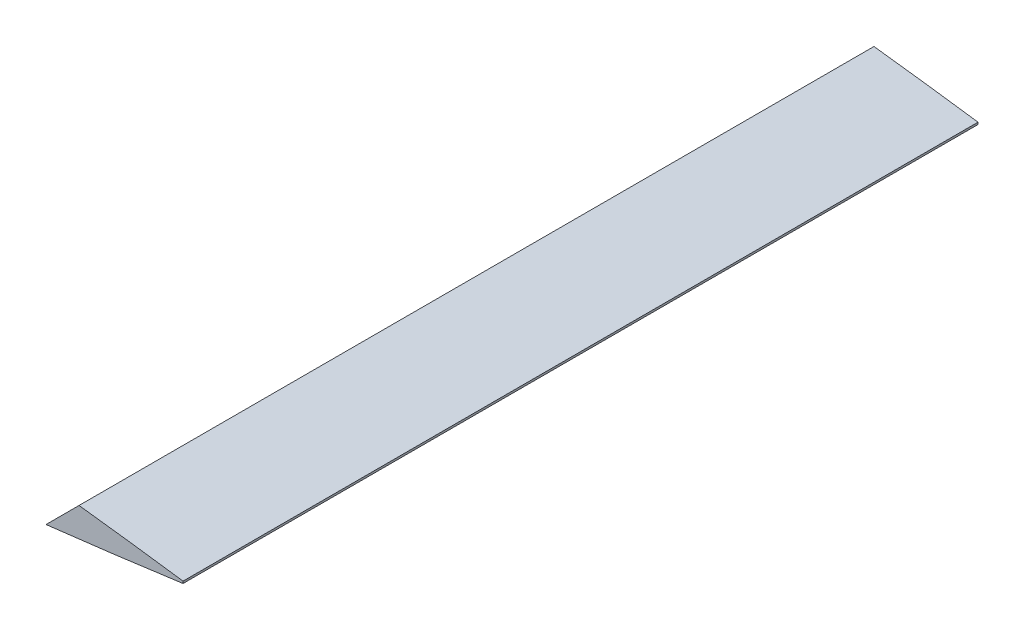
ISO-10303-21;
HEADER;
FILE_DESCRIPTION(('STEP AP214'),'2;1');
FILE_NAME('part.step','',(''),(''),'','','');
FILE_SCHEMA(('AUTOMOTIVE_DESIGN { 1 0 10303 214 1 1 1 1 }'));
ENDSEC;
DATA;
#1=APPLICATION_CONTEXT('core data for automotive mechanical design processes');
#2=APPLICATION_PROTOCOL_DEFINITION('international standard','automotive_design',2000,#1);
#3=PRODUCT_CONTEXT('',#1,'mechanical');
#4=PRODUCT('Part','Part','',(#3));
#5=PRODUCT_RELATED_PRODUCT_CATEGORY('part','',(#4));
#6=PRODUCT_DEFINITION_FORMATION('','',#4);
#7=PRODUCT_DEFINITION_CONTEXT('part definition',#1,'design');
#8=PRODUCT_DEFINITION('design','',#6,#7);
#9=PRODUCT_DEFINITION_SHAPE('','',#8);
#10=(LENGTH_UNIT() NAMED_UNIT(*) SI_UNIT(.MILLI.,.METRE.));
#11=(NAMED_UNIT(*) PLANE_ANGLE_UNIT() SI_UNIT($,.RADIAN.));
#12=(NAMED_UNIT(*) SI_UNIT($,.STERADIAN.) SOLID_ANGLE_UNIT());
#13=UNCERTAINTY_MEASURE_WITH_UNIT(LENGTH_MEASURE(1.E-05),#10,'distance_accuracy_value','');
#14=(GEOMETRIC_REPRESENTATION_CONTEXT(3) GLOBAL_UNCERTAINTY_ASSIGNED_CONTEXT((#13)) GLOBAL_UNIT_ASSIGNED_CONTEXT((#10,
#11,#12)) REPRESENTATION_CONTEXT('',''));
#15=CARTESIAN_POINT('',(0.,0.,0.));
#16=DIRECTION('',(0.,0.,1.));
#17=DIRECTION('',(1.,0.,0.));
#18=AXIS2_PLACEMENT_3D('',#15,#16,#17);
#19=CARTESIAN_POINT('',(300.,0.378,290.));
#20=CARTESIAN_POINT('',(299.270406423723,0.479445821702321,290.));
#21=CARTESIAN_POINT('',(297.234667094079,0.762503753929655,290.));
#22=CARTESIAN_POINT('',(293.659650160598,1.25767350567564,290.));
#23=CARTESIAN_POINT('',(289.112411794917,1.87424244263317,290.));
#24=CARTESIAN_POINT('',(284.080816659039,2.54451744035542,290.));
#25=CARTESIAN_POINT('',(278.752044218457,3.23812231587756,290.));
#26=CARTESIAN_POINT('',(273.265899022492,3.93494643569603,290.));
#27=CARTESIAN_POINT('',(267.705955472008,4.62901994283452,290.));
#28=CARTESIAN_POINT('',(262.114563019878,5.31306910693868,290.));
#29=CARTESIAN_POINT('',(256.508348909458,5.98219181245687,290.));
#30=CARTESIAN_POINT('',(250.891738994323,6.63799080906206,290.));
#31=CARTESIAN_POINT('',(245.269556965141,7.28177923500822,290.));
#32=CARTESIAN_POINT('',(239.647345348642,7.91223276352409,290.));
#33=CARTESIAN_POINT('',(234.025130106878,8.52699204615673,290.));
#34=CARTESIAN_POINT('',(228.399087902931,9.12622976388424,290.));
#35=CARTESIAN_POINT('',(222.76825764507,9.71307760610579,290.));
#36=CARTESIAN_POINT('',(217.135920793231,10.2874598097057,290.));
#37=CARTESIAN_POINT('',(211.505410154051,10.8469410839575,290.));
#38=CARTESIAN_POINT('',(205.877619803237,11.3916428267252,290.));
#39=CARTESIAN_POINT('',(200.251512373849,11.9208846239163,290.));
#40=CARTESIAN_POINT('',(194.626420536409,12.4346170780367,290.));
#41=CARTESIAN_POINT('',(189.002797137157,12.9319118094686,290.));
#42=CARTESIAN_POINT('',(183.381530937822,13.4130975813696,290.));
#43=CARTESIAN_POINT('',(177.763225616091,13.8763767009773,290.));
#44=CARTESIAN_POINT('',(172.148301533052,14.3212371935345,290.));
#45=CARTESIAN_POINT('',(166.537529461529,14.7478209184035,290.));
#46=CARTESIAN_POINT('',(160.931736194082,15.1542281440202,290.));
#47=CARTESIAN_POINT('',(155.331708850266,15.5391008558727,290.));
#48=CARTESIAN_POINT('',(149.737538344952,15.9026495636587,290.));
#49=CARTESIAN_POINT('',(144.148688279318,16.241846118568,290.));
#50=CARTESIAN_POINT('',(138.565679604284,16.5574205464223,290.));
#51=CARTESIAN_POINT('',(132.990859803018,16.8473975552547,290.));
#52=CARTESIAN_POINT('',(127.427439440236,17.1102116785312,290.));
#53=CARTESIAN_POINT('',(121.877619637439,17.3438917175145,290.));
#54=CARTESIAN_POINT('',(116.340758577333,17.5452568128182,290.));
#55=CARTESIAN_POINT('',(110.815476382379,17.712679119923,290.));
#56=CARTESIAN_POINT('',(105.301273398415,17.8444979379819,290.));
#57=CARTESIAN_POINT('',(99.8005701155126,17.9400918128776,290.));
#58=CARTESIAN_POINT('',(94.3174358437247,17.9965904385618,290.));
#59=CARTESIAN_POINT('',(88.8557640671298,18.0101244579531,290.));
#60=CARTESIAN_POINT('',(83.4186479748791,17.9792338403315,290.));
#61=CARTESIAN_POINT('',(78.0084808270908,17.8991607130085,290.));
#62=CARTESIAN_POINT('',(72.6284553647751,17.7670337872511,290.));
#63=CARTESIAN_POINT('',(67.2827387457577,17.5794139337101,290.));
#64=CARTESIAN_POINT('',(61.9773648945375,17.331515488689,290.));
#65=CARTESIAN_POINT('',(56.7206910156783,17.0210326511062,290.));
#66=CARTESIAN_POINT('',(51.5251753215055,16.6409580698619,290.));
#67=CARTESIAN_POINT('',(46.4082026187076,16.1901885907441,290.));
#68=CARTESIAN_POINT('',(41.3941760651905,15.6616690993154,290.));
#69=CARTESIAN_POINT('',(36.5156710865437,15.0539637839737,290.));
#70=CARTESIAN_POINT('',(31.8190094409283,14.3656236049764,290.));
#71=CARTESIAN_POINT('',(27.3661648285309,13.6034756838757,290.));
#72=CARTESIAN_POINT('',(23.2352179540624,12.7825834438859,290.));
#73=CARTESIAN_POINT('',(19.5026424507863,11.9202507512816,290.));
#74=CARTESIAN_POINT('',(16.2182713927649,11.0445977962822,290.));
#75=CARTESIAN_POINT('',(13.3891860155784,10.1750762553965,290.));
#76=CARTESIAN_POINT('',(10.9849293334544,9.33349871540906,290.));
#77=CARTESIAN_POINT('',(8.96156147750924,8.52206288153796,290.));
#78=CARTESIAN_POINT('',(7.26729205281864,7.74697600174495,290.));
#79=CARTESIAN_POINT('',(5.84605246563954,7.01062562176008,290.));
#80=CARTESIAN_POINT('',(4.64771108498271,6.30063403293287,290.));
#81=CARTESIAN_POINT('',(3.62823525123192,5.60651366797511,290.));
#82=CARTESIAN_POINT('',(2.75190919699738,4.92663525162572,290.));
#83=CARTESIAN_POINT('',(2.0062573601689,4.24991725904032,290.));
#84=CARTESIAN_POINT('',(1.39058613668709,3.570259491991,290.));
#85=CARTESIAN_POINT('',(0.901000434809516,2.89094225228363,290.));
#86=CARTESIAN_POINT('',(0.529275534924718,2.22021927340558,290.));
#87=CARTESIAN_POINT('',(0.260479536936117,1.56645893590234,290.));
#88=CARTESIAN_POINT('',(0.0857126538537306,0.931035928118987,290.));
#89=CARTESIAN_POINT('',(-0.00350924718492415,0.308981014512189,290.));
#90=CARTESIAN_POINT('',(-0.00350924718492199,-0.308981014512209,290.));
#91=CARTESIAN_POINT('',(0.0857126538537279,-0.931035928118965,290.));
#92=CARTESIAN_POINT('',(0.260479536936107,-1.56645893590232,290.));
#93=CARTESIAN_POINT('',(0.529275534924743,-2.2202192734056,290.));
#94=CARTESIAN_POINT('',(0.901000434809474,-2.89094225228368,290.));
#95=CARTESIAN_POINT('',(1.39058613668717,-3.57025949199063,290.));
#96=CARTESIAN_POINT('',(2.00625736016862,-4.24991725904197,290.));
#97=CARTESIAN_POINT('',(2.75190919699857,-4.92663525161857,290.));
#98=CARTESIAN_POINT('',(3.62823525122678,-5.60651366800603,290.));
#99=CARTESIAN_POINT('',(4.6477110850053,-6.3006340327972,290.));
#100=CARTESIAN_POINT('',(5.84605246553727,-7.01062562237321,290.));
#101=CARTESIAN_POINT('',(7.26729205329404,-7.74697599889616,290.));
#102=CARTESIAN_POINT('',(8.96156147525896,-8.5220628950217,290.));
#103=CARTESIAN_POINT('',(10.9849293441544,-9.33349865129378,290.));
#104=CARTESIAN_POINT('',(13.3891859649807,-10.1750765585832,290.));
#105=CARTESIAN_POINT('',(16.218271629693,-11.0445963765829,290.));
#106=CARTESIAN_POINT('',(19.5026413612413,-11.9202572799561,290.));
#107=CARTESIAN_POINT('',(23.2352227989104,-12.78255441302,290.));
#108=CARTESIAN_POINT('',(27.3661275586072,-13.6035961608478,290.));
#109=CARTESIAN_POINT('',(31.8190750083372,-14.3651133634918,290.));
#110=CARTESIAN_POINT('',(36.5156346373272,-15.0541060972868,290.));
#111=CARTESIAN_POINT('',(41.3941822041013,-15.6616288870965,290.));
#112=CARTESIAN_POINT('',(46.4082009236496,-16.1901996940233,290.));
#113=CARTESIAN_POINT('',(51.5251757859908,-16.6409550273053,290.));
#114=CARTESIAN_POINT('',(56.7206908890808,-17.0210334803687,290.));
#115=CARTESIAN_POINT('',(61.9773649289189,-17.3315152634777,290.));
#116=CARTESIAN_POINT('',(67.2827387364428,-17.5794139947263,290.));
#117=CARTESIAN_POINT('',(72.6284553672946,-17.767033770747,290.));
#118=CARTESIAN_POINT('',(78.0084808264101,-17.8991607174675,290.));
#119=CARTESIAN_POINT('',(83.4186479750628,-17.9792338391277,290.));
#120=CARTESIAN_POINT('',(88.8557640670803,-18.0101244582778,290.));
#121=CARTESIAN_POINT('',(94.317435843738,-17.9965904384742,290.));
#122=CARTESIAN_POINT('',(99.8005701155091,-17.9400918129012,290.));
#123=CARTESIAN_POINT('',(105.301273398416,-17.8444979379756,290.));
#124=CARTESIAN_POINT('',(110.815476382379,-17.7126791199247,290.));
#125=CARTESIAN_POINT('',(116.340758577333,-17.5452568128177,290.));
#126=CARTESIAN_POINT('',(121.877619637439,-17.3438917175146,290.));
#127=CARTESIAN_POINT('',(127.427439440236,-17.1102116785312,290.));
#128=CARTESIAN_POINT('',(132.990859803018,-16.8473975552547,290.));
#129=CARTESIAN_POINT('',(138.565679604284,-16.5574205464223,290.));
#130=CARTESIAN_POINT('',(144.148688279318,-16.241846118568,290.));
#131=CARTESIAN_POINT('',(149.737538344952,-15.9026495636587,290.));
#132=CARTESIAN_POINT('',(155.331708850266,-15.5391008558727,290.));
#133=CARTESIAN_POINT('',(160.931736194082,-15.1542281440202,290.));
#134=CARTESIAN_POINT('',(166.537529461529,-14.7478209184035,290.));
#135=CARTESIAN_POINT('',(172.148301533052,-14.3212371935345,290.));
#136=CARTESIAN_POINT('',(177.763225616091,-13.8763767009773,290.));
#137=CARTESIAN_POINT('',(183.381530937822,-13.4130975813696,290.));
#138=CARTESIAN_POINT('',(189.002797137156,-12.9319118094686,290.));
#139=CARTESIAN_POINT('',(194.626420536409,-12.4346170780367,290.));
#140=CARTESIAN_POINT('',(200.251512373849,-11.9208846239163,290.));
#141=CARTESIAN_POINT('',(205.877619803237,-11.3916428267251,290.));
#142=CARTESIAN_POINT('',(211.505410154051,-10.8469410839575,290.));
#143=CARTESIAN_POINT('',(217.135920793231,-10.2874598097057,290.));
#144=CARTESIAN_POINT('',(222.76825764507,-9.71307760610578,290.));
#145=CARTESIAN_POINT('',(228.399087902931,-9.12622976388424,290.));
#146=CARTESIAN_POINT('',(234.025130106878,-8.52699204615673,290.));
#147=CARTESIAN_POINT('',(239.647345348642,-7.91223276352409,290.));
#148=CARTESIAN_POINT('',(245.269556965141,-7.28177923500822,290.));
#149=CARTESIAN_POINT('',(250.891738994323,-6.63799080906206,290.));
#150=CARTESIAN_POINT('',(256.508348909458,-5.98219181245686,290.));
#151=CARTESIAN_POINT('',(262.114563019878,-5.31306910693868,290.));
#152=CARTESIAN_POINT('',(267.705955472008,-4.62901994283452,290.));
#153=CARTESIAN_POINT('',(273.265899022492,-3.93494643569603,290.));
#154=CARTESIAN_POINT('',(278.752044218457,-3.23812231587756,290.));
#155=CARTESIAN_POINT('',(284.080816659039,-2.54451744035542,290.));
#156=CARTESIAN_POINT('',(289.112411794917,-1.87424244263317,290.));
#157=CARTESIAN_POINT('',(293.659650160598,-1.25767350567564,290.));
#158=CARTESIAN_POINT('',(297.234667094079,-0.76250375392966,290.));
#159=CARTESIAN_POINT('',(299.270406423723,-0.479445821702321,290.));
#160=CARTESIAN_POINT('',(300.,-0.378,290.));
#161=B_SPLINE_CURVE_WITH_KNOTS('',3,(#19,#20,#21,#22,#23,#24,#25,#26,#27,#28,#29,#30,#31,#32,
#33,#34,#35,#36,#37,#38,#39,#40,#41,#42,#43,#44,#45,#46,#47,#48,#49,#50,#51,#52,#53,#54,#55,#56,
#57,#58,#59,#60,#61,#62,#63,#64,#65,#66,#67,#68,#69,#70,#71,#72,#73,#74,#75,#76,#77,#78,#79,#80,
#81,#82,#83,#84,#85,#86,#87,#88,#89,#90,#91,#92,#93,#94,#95,#96,#97,#98,#99,#100,#101,#102,#103,
#104,#105,#106,#107,#108,#109,#110,#111,#112,#113,#114,#115,#116,#117,#118,#119,#120,#121,#122,
#123,#124,#125,#126,#127,#128,#129,#130,#131,#132,#133,#134,#135,#136,#137,#138,#139,#140,#141,
#142,#143,#144,#145,#146,#147,#148,#149,#150,#151,#152,#153,#154,#155,#156,#157,#158,#159,#160),
.UNSPECIFIED.,.F.,.F.,(4,1,1,1,1,1,1,1,1,1,1,1,1,1,1,1,1,1,1,1,1,1,1,1,1,1,1,1,1,1,1,1,1,1,1,1,
1,1,1,1,1,1,1,1,1,1,1,1,1,1,1,1,1,1,1,1,1,1,1,1,1,1,1,1,1,1,1,1,1,1,1,1,1,1,1,1,1,1,1,1,1,1,1,1,
1,1,1,1,1,1,1,1,1,1,1,1,1,1,1,1,1,1,1,1,1,1,1,1,1,1,1,1,1,1,1,1,1,1,1,1,1,1,1,1,1,1,1,1,1,1,1,1,
1,1,1,1,1,1,1,4),(0.,0.00361222059404388,0.0100789532278554,0.0176986181570895,
0.0261151107220122,0.0349709660638799,0.0440503796486832,0.0532343297369713,0.0624475697827881,
0.0716739929600303,0.0809213185094618,0.0901775382979332,0.0994243421366575,0.108664440992277,
0.117912199004999,0.127169502180609,0.136426594565023,0.145675425736823,0.154916495397513,
0.164153236916375,0.173386648526191,0.182615736180586,0.191838089492061,0.201053134496137,
0.210260392550908,0.219458942389608,0.228646746886173,0.237822316287067,0.24698522413025,
0.25613738364592,0.265279415916296,0.274406949966901,0.283512193452554,0.292591781113348,
0.30164628535433,0.310681792653752,0.31969906757785,0.32869451957993,0.337660159695399,
0.346588583205171,0.355477411634764,0.364322937295264,0.373121613643215,0.381867635356829,
0.390553004884712,0.399166025869356,0.407689628257838,0.416098119030288,0.424354887451602,
0.432412428746428,0.440204728485537,0.447630505181733,0.454563637698397,0.460855379429517,
0.466413319364109,0.471228610451128,0.475365774282038,0.478901259753558,0.481915077255184,
0.484498871900912,0.486747127386087,0.488741251833575,0.490543179252672,0.492182103901344,
0.493672830547239,0.495031907807012,0.496279059618418,0.497424736506128,0.498490165528455,
0.499502757789975,0.500497253863142,0.501509846124661,0.502575275146988,0.503720952034698,
0.504968103846104,0.506327181105877,0.507817907751772,0.509456832400444,0.511258759819541,
0.51325288426703,0.515501139752205,0.518084934397933,0.521098751899559,0.524634237371078,
0.528771401201989,0.533586692289008,0.539144632223599,0.545436373954719,0.552369506471383,
0.559795200118754,0.567587571253572,0.575645112548398,0.583901880969712,0.592310371742162,
0.600833974130644,0.609446995115288,0.618132364643171,0.626878386356785,0.635677062704736,
0.644522588365236,0.653411416794829,0.662339840304601,0.67130548042007,0.68030093242215,
0.689318207346248,0.69835371464567,0.707408218886652,0.716487806547446,0.725593050033099,
0.734720584083704,0.74386261635408,0.75301477586975,0.762177683712933,0.771353253113827,
0.780541057610392,0.789739607449093,0.798946865503863,0.808161910507939,0.817384263819414,
0.826613351473809,0.835846763083625,0.845083504602487,0.854324574263177,0.863573405434977,
0.872830497819391,0.882087800995001,0.891335559007723,0.900575657863343,0.909822461702067,
0.919078681490538,0.92832600703997,0.937552430217212,0.946765670263029,0.955949620351317,
0.96502903393612,0.973884889277988,0.982301381842911,0.989921046772145,0.996387779405956,1.),.UNSPECIFIED.);
#162=DIRECTION('',(0.,0.,-1.));
#163=VECTOR('',#162,1.);
#164=SURFACE_OF_LINEAR_EXTRUSION('',#161,#163);
#165=DIRECTION('',(0.,0.,-1.));
#166=VECTOR('',#165,1.);
#167=CARTESIAN_POINT('',(262.056174111751,5.31733759024931,290.));
#168=LINE('',#167,#166);
#169=CARTESIAN_POINT('',(262.056174116122,5.3173375946203,290.));
#170=VERTEX_POINT('',#169);
#171=CARTESIAN_POINT('',(262.056174116122,5.31733759462032,0.));
#172=VERTEX_POINT('',#171);
#173=EDGE_CURVE('E82',#170,#172,#168,.T.);
#174=ORIENTED_EDGE('',*,*,#173,.F.);
#175=CARTESIAN_POINT('',(300.,0.378,290.));
#176=VERTEX_POINT('',#175);
#177=EDGE_CURVE('E111',#176,#170,#161,.T.);
#178=ORIENTED_EDGE('',*,*,#177,.F.);
#179=DIRECTION('',(0.,0.,-1.));
#180=VECTOR('',#179,1.);
#181=CARTESIAN_POINT('',(300.,0.378,290.));
#182=LINE('',#181,#180);
#183=CARTESIAN_POINT('',(300.,0.378,0.));
#184=VERTEX_POINT('',#183);
#185=EDGE_CURVE('E45',#176,#184,#182,.T.);
#186=ORIENTED_EDGE('',*,*,#185,.T.);
#187=CARTESIAN_POINT('',(300.,0.378,0.));
#188=CARTESIAN_POINT('',(299.270406423723,0.479445821702321,0.));
#189=CARTESIAN_POINT('',(297.234667094079,0.762503753929655,0.));
#190=CARTESIAN_POINT('',(293.659650160598,1.25767350567564,0.));
#191=CARTESIAN_POINT('',(289.112411794917,1.87424244263317,0.));
#192=CARTESIAN_POINT('',(284.080816659039,2.54451744035542,0.));
#193=CARTESIAN_POINT('',(278.752044218457,3.23812231587756,0.));
#194=CARTESIAN_POINT('',(273.265899022492,3.93494643569603,0.));
#195=CARTESIAN_POINT('',(267.705955472008,4.62901994283452,0.));
#196=CARTESIAN_POINT('',(262.114563019878,5.31306910693868,0.));
#197=CARTESIAN_POINT('',(256.508348909458,5.98219181245687,0.));
#198=CARTESIAN_POINT('',(250.891738994323,6.63799080906206,0.));
#199=CARTESIAN_POINT('',(245.269556965141,7.28177923500822,0.));
#200=CARTESIAN_POINT('',(239.647345348642,7.91223276352409,0.));
#201=CARTESIAN_POINT('',(234.025130106878,8.52699204615673,0.));
#202=CARTESIAN_POINT('',(228.399087902931,9.12622976388424,0.));
#203=CARTESIAN_POINT('',(222.76825764507,9.71307760610579,0.));
#204=CARTESIAN_POINT('',(217.135920793231,10.2874598097057,0.));
#205=CARTESIAN_POINT('',(211.505410154051,10.8469410839575,0.));
#206=CARTESIAN_POINT('',(205.877619803237,11.3916428267252,0.));
#207=CARTESIAN_POINT('',(200.251512373849,11.9208846239163,0.));
#208=CARTESIAN_POINT('',(194.626420536409,12.4346170780367,0.));
#209=CARTESIAN_POINT('',(189.002797137157,12.9319118094686,0.));
#210=CARTESIAN_POINT('',(183.381530937822,13.4130975813696,0.));
#211=CARTESIAN_POINT('',(177.763225616091,13.8763767009773,0.));
#212=CARTESIAN_POINT('',(172.148301533052,14.3212371935345,0.));
#213=CARTESIAN_POINT('',(166.537529461529,14.7478209184035,0.));
#214=CARTESIAN_POINT('',(160.931736194082,15.1542281440202,0.));
#215=CARTESIAN_POINT('',(155.331708850266,15.5391008558727,0.));
#216=CARTESIAN_POINT('',(149.737538344952,15.9026495636587,0.));
#217=CARTESIAN_POINT('',(144.148688279318,16.241846118568,0.));
#218=CARTESIAN_POINT('',(138.565679604284,16.5574205464223,0.));
#219=CARTESIAN_POINT('',(132.990859803018,16.8473975552547,0.));
#220=CARTESIAN_POINT('',(127.427439440236,17.1102116785312,0.));
#221=CARTESIAN_POINT('',(121.877619637439,17.3438917175145,0.));
#222=CARTESIAN_POINT('',(116.340758577333,17.5452568128182,0.));
#223=CARTESIAN_POINT('',(110.815476382379,17.712679119923,0.));
#224=CARTESIAN_POINT('',(105.301273398415,17.8444979379819,0.));
#225=CARTESIAN_POINT('',(99.8005701155126,17.9400918128776,0.));
#226=CARTESIAN_POINT('',(94.3174358437247,17.9965904385618,0.));
#227=CARTESIAN_POINT('',(88.8557640671298,18.0101244579531,0.));
#228=CARTESIAN_POINT('',(83.4186479748791,17.9792338403315,0.));
#229=CARTESIAN_POINT('',(78.0084808270908,17.8991607130085,0.));
#230=CARTESIAN_POINT('',(72.6284553647751,17.7670337872511,0.));
#231=CARTESIAN_POINT('',(67.2827387457577,17.5794139337101,0.));
#232=CARTESIAN_POINT('',(61.9773648945375,17.331515488689,0.));
#233=CARTESIAN_POINT('',(56.7206910156783,17.0210326511062,0.));
#234=CARTESIAN_POINT('',(51.5251753215055,16.6409580698619,0.));
#235=CARTESIAN_POINT('',(46.4082026187076,16.1901885907441,0.));
#236=CARTESIAN_POINT('',(41.3941760651905,15.6616690993154,0.));
#237=CARTESIAN_POINT('',(36.5156710865437,15.0539637839737,0.));
#238=CARTESIAN_POINT('',(31.8190094409283,14.3656236049764,0.));
#239=CARTESIAN_POINT('',(27.3661648285309,13.6034756838757,0.));
#240=CARTESIAN_POINT('',(23.2352179540624,12.7825834438859,0.));
#241=CARTESIAN_POINT('',(19.5026424507863,11.9202507512816,0.));
#242=CARTESIAN_POINT('',(16.2182713927649,11.0445977962822,0.));
#243=CARTESIAN_POINT('',(13.3891860155784,10.1750762553965,0.));
#244=CARTESIAN_POINT('',(10.9849293334544,9.33349871540906,0.));
#245=CARTESIAN_POINT('',(8.96156147750924,8.52206288153796,0.));
#246=CARTESIAN_POINT('',(7.26729205281864,7.74697600174495,0.));
#247=CARTESIAN_POINT('',(5.84605246563954,7.01062562176008,0.));
#248=CARTESIAN_POINT('',(4.64771108498271,6.30063403293287,0.));
#249=CARTESIAN_POINT('',(3.62823525123192,5.60651366797511,0.));
#250=CARTESIAN_POINT('',(2.75190919699738,4.92663525162572,0.));
#251=CARTESIAN_POINT('',(2.0062573601689,4.24991725904032,0.));
#252=CARTESIAN_POINT('',(1.39058613668709,3.570259491991,0.));
#253=CARTESIAN_POINT('',(0.901000434809516,2.89094225228363,0.));
#254=CARTESIAN_POINT('',(0.529275534924718,2.22021927340558,0.));
#255=CARTESIAN_POINT('',(0.260479536936117,1.56645893590234,0.));
#256=CARTESIAN_POINT('',(0.0857126538537306,0.931035928118987,0.));
#257=CARTESIAN_POINT('',(-0.00350924718492415,0.308981014512189,0.));
#258=CARTESIAN_POINT('',(-0.00350924718492199,-0.308981014512209,0.));
#259=CARTESIAN_POINT('',(0.0857126538537279,-0.931035928118965,0.));
#260=CARTESIAN_POINT('',(0.260479536936107,-1.56645893590232,0.));
#261=CARTESIAN_POINT('',(0.529275534924743,-2.2202192734056,0.));
#262=CARTESIAN_POINT('',(0.901000434809474,-2.89094225228368,0.));
#263=CARTESIAN_POINT('',(1.39058613668717,-3.57025949199063,0.));
#264=CARTESIAN_POINT('',(2.00625736016862,-4.24991725904197,0.));
#265=CARTESIAN_POINT('',(2.75190919699857,-4.92663525161857,0.));
#266=CARTESIAN_POINT('',(3.62823525122678,-5.60651366800603,0.));
#267=CARTESIAN_POINT('',(4.6477110850053,-6.3006340327972,0.));
#268=CARTESIAN_POINT('',(5.84605246553727,-7.01062562237321,0.));
#269=CARTESIAN_POINT('',(7.26729205329404,-7.74697599889616,0.));
#270=CARTESIAN_POINT('',(8.96156147525896,-8.5220628950217,0.));
#271=CARTESIAN_POINT('',(10.9849293441544,-9.33349865129378,0.));
#272=CARTESIAN_POINT('',(13.3891859649807,-10.1750765585832,0.));
#273=CARTESIAN_POINT('',(16.218271629693,-11.0445963765829,0.));
#274=CARTESIAN_POINT('',(19.5026413612413,-11.9202572799561,0.));
#275=CARTESIAN_POINT('',(23.2352227989104,-12.78255441302,0.));
#276=CARTESIAN_POINT('',(27.3661275586072,-13.6035961608478,0.));
#277=CARTESIAN_POINT('',(31.8190750083372,-14.3651133634918,0.));
#278=CARTESIAN_POINT('',(36.5156346373272,-15.0541060972868,0.));
#279=CARTESIAN_POINT('',(41.3941822041013,-15.6616288870965,0.));
#280=CARTESIAN_POINT('',(46.4082009236496,-16.1901996940233,0.));
#281=CARTESIAN_POINT('',(51.5251757859908,-16.6409550273053,0.));
#282=CARTESIAN_POINT('',(56.7206908890808,-17.0210334803687,0.));
#283=CARTESIAN_POINT('',(61.9773649289189,-17.3315152634777,0.));
#284=CARTESIAN_POINT('',(67.2827387364428,-17.5794139947263,0.));
#285=CARTESIAN_POINT('',(72.6284553672946,-17.767033770747,0.));
#286=CARTESIAN_POINT('',(78.0084808264101,-17.8991607174675,0.));
#287=CARTESIAN_POINT('',(83.4186479750628,-17.9792338391277,0.));
#288=CARTESIAN_POINT('',(88.8557640670803,-18.0101244582778,0.));
#289=CARTESIAN_POINT('',(94.317435843738,-17.9965904384742,0.));
#290=CARTESIAN_POINT('',(99.8005701155091,-17.9400918129012,0.));
#291=CARTESIAN_POINT('',(105.301273398416,-17.8444979379756,0.));
#292=CARTESIAN_POINT('',(110.815476382379,-17.7126791199247,0.));
#293=CARTESIAN_POINT('',(116.340758577333,-17.5452568128177,0.));
#294=CARTESIAN_POINT('',(121.877619637439,-17.3438917175146,0.));
#295=CARTESIAN_POINT('',(127.427439440236,-17.1102116785312,0.));
#296=CARTESIAN_POINT('',(132.990859803018,-16.8473975552547,0.));
#297=CARTESIAN_POINT('',(138.565679604284,-16.5574205464223,0.));
#298=CARTESIAN_POINT('',(144.148688279318,-16.241846118568,0.));
#299=CARTESIAN_POINT('',(149.737538344952,-15.9026495636587,0.));
#300=CARTESIAN_POINT('',(155.331708850266,-15.5391008558727,0.));
#301=CARTESIAN_POINT('',(160.931736194082,-15.1542281440202,0.));
#302=CARTESIAN_POINT('',(166.537529461529,-14.7478209184035,0.));
#303=CARTESIAN_POINT('',(172.148301533052,-14.3212371935345,0.));
#304=CARTESIAN_POINT('',(177.763225616091,-13.8763767009773,0.));
#305=CARTESIAN_POINT('',(183.381530937822,-13.4130975813696,0.));
#306=CARTESIAN_POINT('',(189.002797137156,-12.9319118094686,0.));
#307=CARTESIAN_POINT('',(194.626420536409,-12.4346170780367,0.));
#308=CARTESIAN_POINT('',(200.251512373849,-11.9208846239163,0.));
#309=CARTESIAN_POINT('',(205.877619803237,-11.3916428267251,0.));
#310=CARTESIAN_POINT('',(211.505410154051,-10.8469410839575,0.));
#311=CARTESIAN_POINT('',(217.135920793231,-10.2874598097057,0.));
#312=CARTESIAN_POINT('',(222.76825764507,-9.71307760610578,0.));
#313=CARTESIAN_POINT('',(228.399087902931,-9.12622976388424,0.));
#314=CARTESIAN_POINT('',(234.025130106878,-8.52699204615673,0.));
#315=CARTESIAN_POINT('',(239.647345348642,-7.91223276352409,0.));
#316=CARTESIAN_POINT('',(245.269556965141,-7.28177923500822,0.));
#317=CARTESIAN_POINT('',(250.891738994323,-6.63799080906206,0.));
#318=CARTESIAN_POINT('',(256.508348909458,-5.98219181245686,0.));
#319=CARTESIAN_POINT('',(262.114563019878,-5.31306910693868,0.));
#320=CARTESIAN_POINT('',(267.705955472008,-4.62901994283452,0.));
#321=CARTESIAN_POINT('',(273.265899022492,-3.93494643569603,0.));
#322=CARTESIAN_POINT('',(278.752044218457,-3.23812231587756,0.));
#323=CARTESIAN_POINT('',(284.080816659039,-2.54451744035542,0.));
#324=CARTESIAN_POINT('',(289.112411794917,-1.87424244263317,0.));
#325=CARTESIAN_POINT('',(293.659650160598,-1.25767350567564,0.));
#326=CARTESIAN_POINT('',(297.234667094079,-0.76250375392966,0.));
#327=CARTESIAN_POINT('',(299.270406423723,-0.479445821702321,0.));
#328=CARTESIAN_POINT('',(300.,-0.378,0.));
#329=B_SPLINE_CURVE_WITH_KNOTS('',3,(#187,#188,#189,#190,#191,#192,#193,#194,#195,#196,#197,
#198,#199,#200,#201,#202,#203,#204,#205,#206,#207,#208,#209,#210,#211,#212,#213,#214,#215,#216,
#217,#218,#219,#220,#221,#222,#223,#224,#225,#226,#227,#228,#229,#230,#231,#232,#233,#234,#235,
#236,#237,#238,#239,#240,#241,#242,#243,#244,#245,#246,#247,#248,#249,#250,#251,#252,#253,#254,
#255,#256,#257,#258,#259,#260,#261,#262,#263,#264,#265,#266,#267,#268,#269,#270,#271,#272,#273,
#274,#275,#276,#277,#278,#279,#280,#281,#282,#283,#284,#285,#286,#287,#288,#289,#290,#291,#292,
#293,#294,#295,#296,#297,#298,#299,#300,#301,#302,#303,#304,#305,#306,#307,#308,#309,#310,#311,
#312,#313,#314,#315,#316,#317,#318,#319,#320,#321,#322,#323,#324,#325,#326,#327,#328),
.UNSPECIFIED.,.F.,.F.,(4,1,1,1,1,1,1,1,1,1,1,1,1,1,1,1,1,1,1,1,1,1,1,1,1,1,1,1,1,1,1,1,1,1,1,1,
1,1,1,1,1,1,1,1,1,1,1,1,1,1,1,1,1,1,1,1,1,1,1,1,1,1,1,1,1,1,1,1,1,1,1,1,1,1,1,1,1,1,1,1,1,1,1,1,
1,1,1,1,1,1,1,1,1,1,1,1,1,1,1,1,1,1,1,1,1,1,1,1,1,1,1,1,1,1,1,1,1,1,1,1,1,1,1,1,1,1,1,1,1,1,1,1,
1,1,1,1,1,1,1,4),(0.,0.00361222059404388,0.0100789532278554,0.0176986181570895,
0.0261151107220122,0.0349709660638799,0.0440503796486832,0.0532343297369713,0.0624475697827881,
0.0716739929600303,0.0809213185094618,0.0901775382979332,0.0994243421366575,0.108664440992277,
0.117912199004999,0.127169502180609,0.136426594565023,0.145675425736823,0.154916495397513,
0.164153236916375,0.173386648526191,0.182615736180586,0.191838089492061,0.201053134496137,
0.210260392550908,0.219458942389608,0.228646746886173,0.237822316287067,0.24698522413025,
0.25613738364592,0.265279415916296,0.274406949966901,0.283512193452554,0.292591781113348,
0.30164628535433,0.310681792653752,0.31969906757785,0.32869451957993,0.337660159695399,
0.346588583205171,0.355477411634764,0.364322937295264,0.373121613643215,0.381867635356829,
0.390553004884712,0.399166025869356,0.407689628257838,0.416098119030288,0.424354887451602,
0.432412428746428,0.440204728485537,0.447630505181733,0.454563637698397,0.460855379429517,
0.466413319364109,0.471228610451128,0.475365774282038,0.478901259753558,0.481915077255184,
0.484498871900912,0.486747127386087,0.488741251833575,0.490543179252672,0.492182103901344,
0.493672830547239,0.495031907807012,0.496279059618418,0.497424736506128,0.498490165528455,
0.499502757789975,0.500497253863142,0.501509846124661,0.502575275146988,0.503720952034698,
0.504968103846104,0.506327181105877,0.507817907751772,0.509456832400444,0.511258759819541,
0.51325288426703,0.515501139752205,0.518084934397933,0.521098751899559,0.524634237371078,
0.528771401201989,0.533586692289008,0.539144632223599,0.545436373954719,0.552369506471383,
0.559795200118754,0.567587571253572,0.575645112548398,0.583901880969712,0.592310371742162,
0.600833974130644,0.609446995115288,0.618132364643171,0.626878386356785,0.635677062704736,
0.644522588365236,0.653411416794829,0.662339840304601,0.67130548042007,0.68030093242215,
0.689318207346248,0.69835371464567,0.707408218886652,0.716487806547446,0.725593050033099,
0.734720584083704,0.74386261635408,0.75301477586975,0.762177683712933,0.771353253113827,
0.780541057610392,0.789739607449093,0.798946865503863,0.808161910507939,0.817384263819414,
0.826613351473809,0.835846763083625,0.845083504602487,0.854324574263177,0.863573405434977,
0.872830497819391,0.882087800995001,0.891335559007723,0.900575657863343,0.909822461702067,
0.919078681490538,0.92832600703997,0.937552430217212,0.946765670263029,0.955949620351317,
0.96502903393612,0.973884889277988,0.982301381842911,0.989921046772145,0.996387779405956,1.),.UNSPECIFIED.);
#330=EDGE_CURVE('E94',#184,#172,#329,.T.);
#331=ORIENTED_EDGE('',*,*,#330,.T.);
#332=EDGE_LOOP('',(#174,#178,#186,#331));
#333=FACE_BOUND('',#332,.T.);
#334=ADVANCED_FACE('F34',(#333),#164,.F.);
#335=CARTESIAN_POINT('',(6.8064612781216E-05,3.56765379046865E-06,290.));
#336=DIRECTION('',(0.,0.,-1.));
#337=DIRECTION('',(-1.,0.,0.));
#338=AXIS2_PLACEMENT_3D('',#335,#336,#337);
#339=PLANE('',#338);
#340=DIRECTION('',(0.707106781186543,0.707106781186552,0.));
#341=VECTOR('',#340,1.);
#342=CARTESIAN_POINT('',(128.369454076886,-128.369382444618,290.));
#343=LINE('',#342,#341);
#344=CARTESIAN_POINT('',(250.,-6.73883652150179,290.));
#345=VERTEX_POINT('',#344);
#346=EDGE_CURVE('E85',#345,#170,#343,.T.);
#347=ORIENTED_EDGE('',*,*,#346,.F.);
#348=CARTESIAN_POINT('',(300.,-0.378,290.));
#349=VERTEX_POINT('',#348);
#350=EDGE_CURVE('E39',#345,#349,#161,.T.);
#351=ORIENTED_EDGE('',*,*,#350,.T.);
#352=DIRECTION('',(0.,1.,0.));
#353=VECTOR('',#352,1.);
#354=CARTESIAN_POINT('',(300.,0.378,290.));
#355=LINE('',#354,#353);
#356=EDGE_CURVE('E54',#349,#176,#355,.T.);
#357=ORIENTED_EDGE('',*,*,#356,.T.);
#358=ORIENTED_EDGE('',*,*,#177,.T.);
#359=EDGE_LOOP('',(#347,#351,#357,#358));
#360=FACE_BOUND('',#359,.T.);
#361=ADVANCED_FACE('F110',(#360),#339,.F.);
#362=CARTESIAN_POINT('',(6.8064612781216E-05,3.56765379046865E-06,0.));
#363=DIRECTION('',(0.,0.,-1.));
#364=DIRECTION('',(-1.,0.,0.));
#365=AXIS2_PLACEMENT_3D('',#362,#363,#364);
#366=PLANE('',#365);
#367=CARTESIAN_POINT('',(250.,-6.73883652150179,0.));
#368=VERTEX_POINT('',#367);
#369=CARTESIAN_POINT('',(300.,-0.378,0.));
#370=VERTEX_POINT('',#369);
#371=EDGE_CURVE('E65',#368,#370,#329,.T.);
#372=ORIENTED_EDGE('',*,*,#371,.F.);
#373=DIRECTION('',(0.707106781186543,0.707106781186552,0.));
#374=VECTOR('',#373,1.);
#375=CARTESIAN_POINT('',(250.,-6.73883652150179,0.));
#376=LINE('',#375,#374);
#377=EDGE_CURVE('E74',#368,#172,#376,.T.);
#378=ORIENTED_EDGE('',*,*,#377,.T.);
#379=ORIENTED_EDGE('',*,*,#330,.F.);
#380=DIRECTION('',(0.,1.,0.));
#381=VECTOR('',#380,1.);
#382=CARTESIAN_POINT('',(300.,0.378,0.));
#383=LINE('',#382,#381);
#384=EDGE_CURVE('E97',#370,#184,#383,.T.);
#385=ORIENTED_EDGE('',*,*,#384,.F.);
#386=EDGE_LOOP('',(#372,#378,#379,#385));
#387=FACE_BOUND('',#386,.T.);
#388=ADVANCED_FACE('F93',(#387),#366,.T.);
#389=ORIENTED_EDGE('',*,*,#350,.F.);
#390=DIRECTION('',(0.,0.,-1.));
#391=VECTOR('',#390,1.);
#392=CARTESIAN_POINT('',(250.,-6.73883651929539,290.));
#393=LINE('',#392,#391);
#394=EDGE_CURVE('E89',#345,#368,#393,.T.);
#395=ORIENTED_EDGE('',*,*,#394,.T.);
#396=ORIENTED_EDGE('',*,*,#371,.T.);
#397=DIRECTION('',(0.,0.,-1.));
#398=VECTOR('',#397,1.);
#399=CARTESIAN_POINT('',(300.,-0.378,290.));
#400=LINE('',#399,#398);
#401=EDGE_CURVE('E12',#349,#370,#400,.T.);
#402=ORIENTED_EDGE('',*,*,#401,.F.);
#403=EDGE_LOOP('',(#389,#395,#396,#402));
#404=FACE_BOUND('',#403,.T.);
#405=ADVANCED_FACE('F36',(#404),#164,.F.);
#406=CARTESIAN_POINT('',(300.,0.378,290.));
#407=DIRECTION('',(-1.,0.,0.));
#408=DIRECTION('',(0.,0.,1.));
#409=AXIS2_PLACEMENT_3D('',#406,#407,#408);
#410=PLANE('',#409);
#411=ORIENTED_EDGE('',*,*,#384,.T.);
#412=ORIENTED_EDGE('',*,*,#185,.F.);
#413=ORIENTED_EDGE('',*,*,#356,.F.);
#414=ORIENTED_EDGE('',*,*,#401,.T.);
#415=EDGE_LOOP('',(#411,#412,#413,#414));
#416=FACE_BOUND('',#415,.T.);
#417=ADVANCED_FACE('F123',(#416),#410,.F.);
#418=CARTESIAN_POINT('',(250.,-6.73883652150179,300.));
#419=DIRECTION('',(-0.707106781186552,0.707106781186543,0.));
#420=DIRECTION('',(-0.707106781186543,-0.707106781186552,0.));
#421=AXIS2_PLACEMENT_3D('',#418,#419,#420);
#422=PLANE('',#421);
#423=ORIENTED_EDGE('',*,*,#173,.T.);
#424=ORIENTED_EDGE('',*,*,#377,.F.);
#425=ORIENTED_EDGE('',*,*,#394,.F.);
#426=ORIENTED_EDGE('',*,*,#346,.T.);
#427=EDGE_LOOP('',(#423,#424,#425,#426));
#428=FACE_BOUND('',#427,.T.);
#429=ADVANCED_FACE('F83',(#428),#422,.T.);
#430=CLOSED_SHELL('',(#334,#361,#388,#405,#417,#429));
#431=MANIFOLD_SOLID_BREP('B2',#430);
#432=ADVANCED_BREP_SHAPE_REPRESENTATION('',(#18,#431),#14);
#433=SHAPE_DEFINITION_REPRESENTATION(#9,#432);
ENDSEC;
END-ISO-10303-21;
